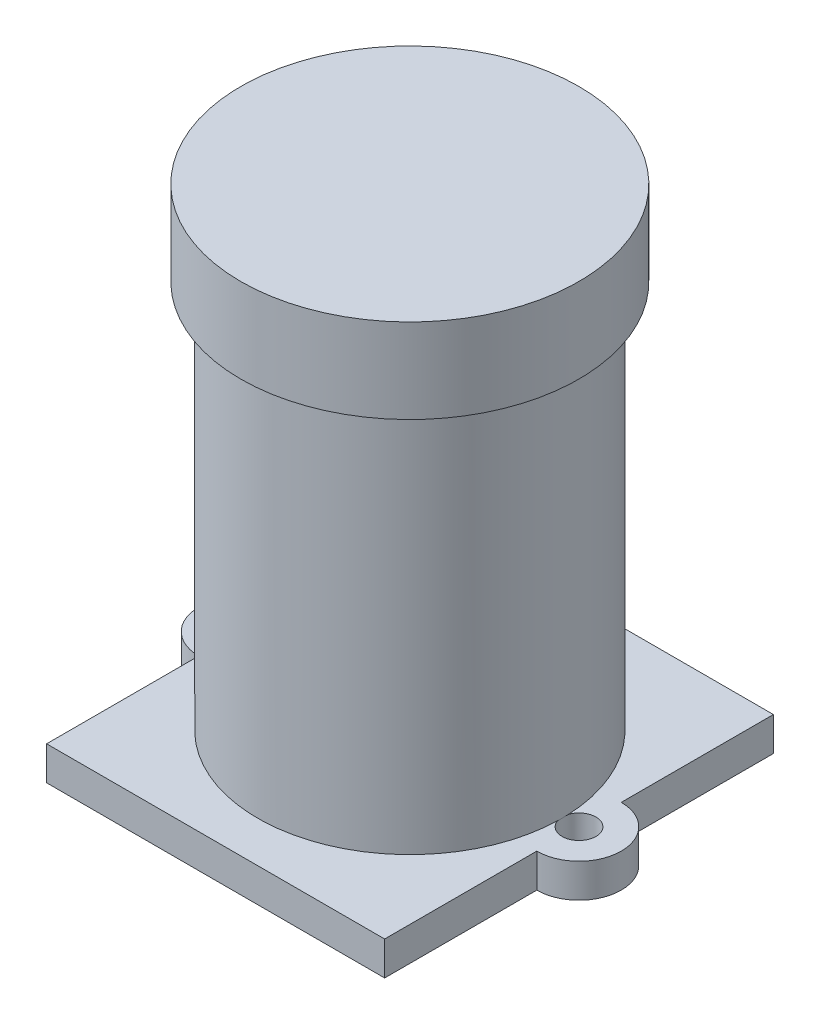
ISO-10303-21;
HEADER;
FILE_DESCRIPTION(('STEP AP214'),'2;1');
FILE_NAME('part.step','',(''),(''),'','','');
FILE_SCHEMA(('AUTOMOTIVE_DESIGN { 1 0 10303 214 1 1 1 1 }'));
ENDSEC;
DATA;
#1=APPLICATION_CONTEXT('core data for automotive mechanical design processes');
#2=APPLICATION_PROTOCOL_DEFINITION('international standard','automotive_design',2000,#1);
#3=PRODUCT_CONTEXT('',#1,'mechanical');
#4=PRODUCT('Part','Part','',(#3));
#5=PRODUCT_RELATED_PRODUCT_CATEGORY('part','',(#4));
#6=PRODUCT_DEFINITION_FORMATION('','',#4);
#7=PRODUCT_DEFINITION_CONTEXT('part definition',#1,'design');
#8=PRODUCT_DEFINITION('design','',#6,#7);
#9=PRODUCT_DEFINITION_SHAPE('','',#8);
#10=(LENGTH_UNIT() NAMED_UNIT(*) SI_UNIT(.MILLI.,.METRE.));
#11=(NAMED_UNIT(*) PLANE_ANGLE_UNIT() SI_UNIT($,.RADIAN.));
#12=(NAMED_UNIT(*) SI_UNIT($,.STERADIAN.) SOLID_ANGLE_UNIT());
#13=UNCERTAINTY_MEASURE_WITH_UNIT(LENGTH_MEASURE(1.E-05),#10,'distance_accuracy_value','');
#14=(GEOMETRIC_REPRESENTATION_CONTEXT(3) GLOBAL_UNCERTAINTY_ASSIGNED_CONTEXT((#13)) GLOBAL_UNIT_ASSIGNED_CONTEXT((#10,
#11,#12)) REPRESENTATION_CONTEXT('',''));
#15=CARTESIAN_POINT('',(0.,0.,0.));
#16=DIRECTION('',(0.,0.,1.));
#17=DIRECTION('',(1.,0.,0.));
#18=AXIS2_PLACEMENT_3D('',#15,#16,#17);
#19=CARTESIAN_POINT('',(0.,2.,0.));
#20=DIRECTION('',(1.,0.,0.));
#21=DIRECTION('',(0.,0.,-1.));
#22=AXIS2_PLACEMENT_3D('',#19,#20,#21);
#23=PLANE('',#22);
#24=DIRECTION('',(0.,0.,1.));
#25=VECTOR('',#24,1.);
#26=CARTESIAN_POINT('',(0.,0.,0.));
#27=LINE('',#26,#25);
#28=CARTESIAN_POINT('',(0.,0.,0.));
#29=VERTEX_POINT('',#28);
#30=CARTESIAN_POINT('',(0.,0.,9.));
#31=VERTEX_POINT('',#30);
#32=EDGE_CURVE('E163',#29,#31,#27,.T.);
#33=ORIENTED_EDGE('',*,*,#32,.T.);
#34=DIRECTION('',(0.,-1.,0.));
#35=VECTOR('',#34,1.);
#36=CARTESIAN_POINT('',(0.,2.,9.));
#37=LINE('',#36,#35);
#38=CARTESIAN_POINT('',(0.,2.,9.));
#39=VERTEX_POINT('',#38);
#40=EDGE_CURVE('E45',#39,#31,#37,.T.);
#41=ORIENTED_EDGE('',*,*,#40,.F.);
#42=DIRECTION('',(0.,0.,1.));
#43=VECTOR('',#42,1.);
#44=CARTESIAN_POINT('',(0.,2.,0.));
#45=LINE('',#44,#43);
#46=CARTESIAN_POINT('',(0.,2.,0.));
#47=VERTEX_POINT('',#46);
#48=EDGE_CURVE('E234',#47,#39,#45,.T.);
#49=ORIENTED_EDGE('',*,*,#48,.F.);
#50=DIRECTION('',(0.,-1.,0.));
#51=VECTOR('',#50,1.);
#52=CARTESIAN_POINT('',(0.,2.,0.));
#53=LINE('',#52,#51);
#54=EDGE_CURVE('E65',#47,#29,#53,.T.);
#55=ORIENTED_EDGE('',*,*,#54,.T.);
#56=EDGE_LOOP('',(#33,#41,#49,#55));
#57=FACE_BOUND('',#56,.T.);
#58=ADVANCED_FACE('F41',(#57),#23,.F.);
#59=CARTESIAN_POINT('',(0.,2.,11.5));
#60=DIRECTION('',(0.,-1.,0.));
#61=DIRECTION('',(0.,0.,-1.));
#62=AXIS2_PLACEMENT_3D('',#59,#60,#61);
#63=CYLINDRICAL_SURFACE('',#62,2.5);
#64=CARTESIAN_POINT('',(0.,0.,11.5));
#65=DIRECTION('',(0.,1.,0.));
#66=DIRECTION('',(0.,0.,1.));
#67=AXIS2_PLACEMENT_3D('',#64,#65,#66);
#68=CIRCLE('',#67,2.5);
#69=CARTESIAN_POINT('',(0.,0.,14.));
#70=VERTEX_POINT('',#69);
#71=EDGE_CURVE('E166',#31,#70,#68,.T.);
#72=ORIENTED_EDGE('',*,*,#71,.T.);
#73=DIRECTION('',(0.,-1.,0.));
#74=VECTOR('',#73,1.);
#75=CARTESIAN_POINT('',(0.,2.,14.));
#76=LINE('',#75,#74);
#77=CARTESIAN_POINT('',(0.,2.,14.));
#78=VERTEX_POINT('',#77);
#79=EDGE_CURVE('E202',#78,#70,#76,.T.);
#80=ORIENTED_EDGE('',*,*,#79,.F.);
#81=CARTESIAN_POINT('',(0.,2.,11.5));
#82=DIRECTION('',(0.,1.,0.));
#83=DIRECTION('',(0.,0.,1.));
#84=AXIS2_PLACEMENT_3D('',#81,#82,#83);
#85=CIRCLE('',#84,2.5);
#86=EDGE_CURVE('E105',#39,#78,#85,.T.);
#87=ORIENTED_EDGE('',*,*,#86,.F.);
#88=ORIENTED_EDGE('',*,*,#40,.T.);
#89=EDGE_LOOP('',(#72,#80,#87,#88));
#90=FACE_BOUND('',#89,.T.);
#91=ADVANCED_FACE('F210',(#90),#63,.T.);
#92=CARTESIAN_POINT('',(0.,2.,0.));
#93=DIRECTION('',(1.,0.,0.));
#94=DIRECTION('',(0.,0.,-1.));
#95=AXIS2_PLACEMENT_3D('',#92,#93,#94);
#96=PLANE('',#95);
#97=DIRECTION('',(0.,0.,1.));
#98=VECTOR('',#97,1.);
#99=CARTESIAN_POINT('',(0.,0.,0.));
#100=LINE('',#99,#98);
#101=CARTESIAN_POINT('',(0.,0.,23.));
#102=VERTEX_POINT('',#101);
#103=EDGE_CURVE('E169',#70,#102,#100,.T.);
#104=ORIENTED_EDGE('',*,*,#103,.T.);
#105=DIRECTION('',(0.,-1.,0.));
#106=VECTOR('',#105,1.);
#107=CARTESIAN_POINT('',(0.,2.,23.));
#108=LINE('',#107,#106);
#109=CARTESIAN_POINT('',(0.,2.,23.));
#110=VERTEX_POINT('',#109);
#111=EDGE_CURVE('E199',#110,#102,#108,.T.);
#112=ORIENTED_EDGE('',*,*,#111,.F.);
#113=DIRECTION('',(0.,0.,1.));
#114=VECTOR('',#113,1.);
#115=CARTESIAN_POINT('',(0.,2.,0.));
#116=LINE('',#115,#114);
#117=EDGE_CURVE('E224',#78,#110,#116,.T.);
#118=ORIENTED_EDGE('',*,*,#117,.F.);
#119=ORIENTED_EDGE('',*,*,#79,.T.);
#120=EDGE_LOOP('',(#104,#112,#118,#119));
#121=FACE_BOUND('',#120,.T.);
#122=ADVANCED_FACE('F223',(#121),#96,.F.);
#123=CARTESIAN_POINT('',(0.,2.,23.));
#124=DIRECTION('',(0.,0.,-1.));
#125=DIRECTION('',(-1.,0.,0.));
#126=AXIS2_PLACEMENT_3D('',#123,#124,#125);
#127=PLANE('',#126);
#128=DIRECTION('',(1.,0.,0.));
#129=VECTOR('',#128,1.);
#130=CARTESIAN_POINT('',(0.,0.,23.));
#131=LINE('',#130,#129);
#132=CARTESIAN_POINT('',(20.,0.,23.));
#133=VERTEX_POINT('',#132);
#134=EDGE_CURVE('E172',#102,#133,#131,.T.);
#135=ORIENTED_EDGE('',*,*,#134,.T.);
#136=DIRECTION('',(0.,-1.,0.));
#137=VECTOR('',#136,1.);
#138=CARTESIAN_POINT('',(20.,2.,23.));
#139=LINE('',#138,#137);
#140=CARTESIAN_POINT('',(20.,2.,23.));
#141=VERTEX_POINT('',#140);
#142=EDGE_CURVE('E196',#141,#133,#139,.T.);
#143=ORIENTED_EDGE('',*,*,#142,.F.);
#144=DIRECTION('',(1.,0.,0.));
#145=VECTOR('',#144,1.);
#146=CARTESIAN_POINT('',(0.,2.,23.));
#147=LINE('',#146,#145);
#148=EDGE_CURVE('E225',#110,#141,#147,.T.);
#149=ORIENTED_EDGE('',*,*,#148,.F.);
#150=ORIENTED_EDGE('',*,*,#111,.T.);
#151=EDGE_LOOP('',(#135,#143,#149,#150));
#152=FACE_BOUND('',#151,.T.);
#153=ADVANCED_FACE('F221',(#152),#127,.F.);
#154=CARTESIAN_POINT('',(20.,2.,0.));
#155=DIRECTION('',(1.,0.,0.));
#156=DIRECTION('',(0.,0.,-1.));
#157=AXIS2_PLACEMENT_3D('',#154,#155,#156);
#158=PLANE('',#157);
#159=DIRECTION('',(0.,0.,1.));
#160=VECTOR('',#159,1.);
#161=CARTESIAN_POINT('',(20.,0.,0.));
#162=LINE('',#161,#160);
#163=CARTESIAN_POINT('',(20.,0.,14.));
#164=VERTEX_POINT('',#163);
#165=EDGE_CURVE('E176',#164,#133,#162,.T.);
#166=ORIENTED_EDGE('',*,*,#165,.F.);
#167=DIRECTION('',(0.,-1.,0.));
#168=VECTOR('',#167,1.);
#169=CARTESIAN_POINT('',(20.,2.,14.));
#170=LINE('',#169,#168);
#171=CARTESIAN_POINT('',(20.,2.,14.));
#172=VERTEX_POINT('',#171);
#173=EDGE_CURVE('E143',#172,#164,#170,.T.);
#174=ORIENTED_EDGE('',*,*,#173,.F.);
#175=DIRECTION('',(0.,0.,1.));
#176=VECTOR('',#175,1.);
#177=CARTESIAN_POINT('',(20.,2.,0.));
#178=LINE('',#177,#176);
#179=EDGE_CURVE('E130',#172,#141,#178,.T.);
#180=ORIENTED_EDGE('',*,*,#179,.T.);
#181=ORIENTED_EDGE('',*,*,#142,.T.);
#182=EDGE_LOOP('',(#166,#174,#180,#181));
#183=FACE_BOUND('',#182,.T.);
#184=ADVANCED_FACE('F217',(#183),#158,.T.);
#185=CARTESIAN_POINT('',(20.,2.,11.5));
#186=DIRECTION('',(0.,-1.,0.));
#187=DIRECTION('',(0.,0.,-1.));
#188=AXIS2_PLACEMENT_3D('',#185,#186,#187);
#189=CYLINDRICAL_SURFACE('',#188,2.5);
#190=CARTESIAN_POINT('',(20.,0.,11.5));
#191=DIRECTION('',(0.,1.,0.));
#192=DIRECTION('',(0.,0.,1.));
#193=AXIS2_PLACEMENT_3D('',#190,#191,#192);
#194=CIRCLE('',#193,2.5);
#195=CARTESIAN_POINT('',(20.,0.,9.));
#196=VERTEX_POINT('',#195);
#197=EDGE_CURVE('E138',#164,#196,#194,.T.);
#198=ORIENTED_EDGE('',*,*,#197,.T.);
#199=DIRECTION('',(0.,-1.,0.));
#200=VECTOR('',#199,1.);
#201=CARTESIAN_POINT('',(20.,2.,9.));
#202=LINE('',#201,#200);
#203=CARTESIAN_POINT('',(20.,2.,9.));
#204=VERTEX_POINT('',#203);
#205=EDGE_CURVE('E135',#204,#196,#202,.T.);
#206=ORIENTED_EDGE('',*,*,#205,.F.);
#207=CARTESIAN_POINT('',(20.,2.,11.5));
#208=DIRECTION('',(0.,1.,0.));
#209=DIRECTION('',(0.,0.,1.));
#210=AXIS2_PLACEMENT_3D('',#207,#208,#209);
#211=CIRCLE('',#210,2.5);
#212=EDGE_CURVE('E123',#172,#204,#211,.T.);
#213=ORIENTED_EDGE('',*,*,#212,.F.);
#214=ORIENTED_EDGE('',*,*,#173,.T.);
#215=EDGE_LOOP('',(#198,#206,#213,#214));
#216=FACE_BOUND('',#215,.T.);
#217=ADVANCED_FACE('F136',(#216),#189,.T.);
#218=CARTESIAN_POINT('',(20.,2.,0.));
#219=DIRECTION('',(1.,0.,0.));
#220=DIRECTION('',(0.,0.,-1.));
#221=AXIS2_PLACEMENT_3D('',#218,#219,#220);
#222=PLANE('',#221);
#223=DIRECTION('',(0.,0.,1.));
#224=VECTOR('',#223,1.);
#225=CARTESIAN_POINT('',(20.,0.,0.));
#226=LINE('',#225,#224);
#227=CARTESIAN_POINT('',(20.,0.,0.));
#228=VERTEX_POINT('',#227);
#229=EDGE_CURVE('E182',#228,#196,#226,.T.);
#230=ORIENTED_EDGE('',*,*,#229,.F.);
#231=DIRECTION('',(0.,-1.,0.));
#232=VECTOR('',#231,1.);
#233=CARTESIAN_POINT('',(20.,2.,0.));
#234=LINE('',#233,#232);
#235=CARTESIAN_POINT('',(20.,2.,0.));
#236=VERTEX_POINT('',#235);
#237=EDGE_CURVE('E144',#236,#228,#234,.T.);
#238=ORIENTED_EDGE('',*,*,#237,.F.);
#239=DIRECTION('',(0.,0.,1.));
#240=VECTOR('',#239,1.);
#241=CARTESIAN_POINT('',(20.,2.,0.));
#242=LINE('',#241,#240);
#243=EDGE_CURVE('E128',#236,#204,#242,.T.);
#244=ORIENTED_EDGE('',*,*,#243,.T.);
#245=ORIENTED_EDGE('',*,*,#205,.T.);
#246=EDGE_LOOP('',(#230,#238,#244,#245));
#247=FACE_BOUND('',#246,.T.);
#248=ADVANCED_FACE('F146',(#247),#222,.T.);
#249=CARTESIAN_POINT('',(20.,2.,11.5));
#250=DIRECTION('',(0.,-1.,0.));
#251=DIRECTION('',(0.,0.,-1.));
#252=AXIS2_PLACEMENT_3D('',#249,#250,#251);
#253=CYLINDRICAL_SURFACE('',#252,1.);
#254=CARTESIAN_POINT('',(20.,2.,11.5));
#255=DIRECTION('',(0.,1.,0.));
#256=DIRECTION('',(0.,0.,1.));
#257=AXIS2_PLACEMENT_3D('',#254,#255,#256);
#258=CIRCLE('',#257,1.);
#259=CARTESIAN_POINT('',(19.0535568816368,2.,11.1771294009932));
#260=VERTEX_POINT('',#259);
#261=CARTESIAN_POINT('',(19.058302830222,2.,11.8364616477878));
#262=VERTEX_POINT('',#261);
#263=EDGE_CURVE('E237',#260,#262,#258,.T.);
#264=ORIENTED_EDGE('',*,*,#263,.T.);
#265=EDGE_CURVE('E241',#262,#260,#258,.T.);
#266=ORIENTED_EDGE('',*,*,#265,.T.);
#267=EDGE_LOOP('',(#264,#266));
#268=FACE_BOUND('',#267,.T.);
#269=CARTESIAN_POINT('',(20.,0.,11.5));
#270=DIRECTION('',(0.,1.,0.));
#271=DIRECTION('',(0.,0.,1.));
#272=AXIS2_PLACEMENT_3D('',#269,#270,#271);
#273=CIRCLE('',#272,1.);
#274=CARTESIAN_POINT('',(20.,0.,12.5));
#275=VERTEX_POINT('',#274);
#276=EDGE_CURVE('E158',#275,#275,#273,.T.);
#277=ORIENTED_EDGE('',*,*,#276,.F.);
#278=EDGE_LOOP('',(#277));
#279=FACE_BOUND('',#278,.T.);
#280=ADVANCED_FACE('F283',(#268,#279),#253,.F.);
#281=CARTESIAN_POINT('',(0.,2.,11.5));
#282=DIRECTION('',(0.,-1.,0.));
#283=DIRECTION('',(0.,0.,-1.));
#284=AXIS2_PLACEMENT_3D('',#281,#282,#283);
#285=CYLINDRICAL_SURFACE('',#284,1.);
#286=CARTESIAN_POINT('',(0.,2.,11.5));
#287=DIRECTION('',(0.,1.,0.));
#288=DIRECTION('',(0.,0.,1.));
#289=AXIS2_PLACEMENT_3D('',#286,#287,#288);
#290=CIRCLE('',#289,1.);
#291=CARTESIAN_POINT('',(0.,2.,12.5));
#292=VERTEX_POINT('',#291);
#293=EDGE_CURVE('E189',#292,#292,#290,.T.);
#294=ORIENTED_EDGE('',*,*,#293,.T.);
#295=EDGE_LOOP('',(#294));
#296=FACE_BOUND('',#295,.T.);
#297=CARTESIAN_POINT('',(0.,0.,11.5));
#298=DIRECTION('',(0.,1.,0.));
#299=DIRECTION('',(0.,0.,1.));
#300=AXIS2_PLACEMENT_3D('',#297,#298,#299);
#301=CIRCLE('',#300,1.);
#302=CARTESIAN_POINT('',(0.,0.,12.5));
#303=VERTEX_POINT('',#302);
#304=EDGE_CURVE('E154',#303,#303,#301,.T.);
#305=ORIENTED_EDGE('',*,*,#304,.F.);
#306=EDGE_LOOP('',(#305));
#307=FACE_BOUND('',#306,.T.);
#308=ADVANCED_FACE('F43',(#296,#307),#285,.F.);
#309=CARTESIAN_POINT('',(0.,2.,0.));
#310=DIRECTION('',(0.,0.,-1.));
#311=DIRECTION('',(-1.,0.,0.));
#312=AXIS2_PLACEMENT_3D('',#309,#310,#311);
#313=PLANE('',#312);
#314=DIRECTION('',(1.,0.,0.));
#315=VECTOR('',#314,1.);
#316=CARTESIAN_POINT('',(0.,0.,0.));
#317=LINE('',#316,#315);
#318=EDGE_CURVE('E185',#29,#228,#317,.T.);
#319=ORIENTED_EDGE('',*,*,#318,.F.);
#320=ORIENTED_EDGE('',*,*,#54,.F.);
#321=DIRECTION('',(1.,0.,0.));
#322=VECTOR('',#321,1.);
#323=CARTESIAN_POINT('',(0.,2.,0.));
#324=LINE('',#323,#322);
#325=EDGE_CURVE('E148',#47,#236,#324,.T.);
#326=ORIENTED_EDGE('',*,*,#325,.T.);
#327=ORIENTED_EDGE('',*,*,#237,.T.);
#328=EDGE_LOOP('',(#319,#320,#326,#327));
#329=FACE_BOUND('',#328,.T.);
#330=ADVANCED_FACE('F213',(#329),#313,.T.);
#331=CARTESIAN_POINT('',(0.,2.,0.));
#332=DIRECTION('',(0.,1.,0.));
#333=DIRECTION('',(0.,0.,1.));
#334=AXIS2_PLACEMENT_3D('',#331,#332,#333);
#335=PLANE('',#334);
#336=CARTESIAN_POINT('',(10.062202951902,2.,11.5715333946873));
#337=DIRECTION('',(0.,1.,0.));
#338=DIRECTION('',(0.,0.,1.));
#339=AXIS2_PLACEMENT_3D('',#336,#337,#338);
#340=CIRCLE('',#339,9.);
#341=EDGE_CURVE('E11',#260,#262,#340,.T.);
#342=ORIENTED_EDGE('',*,*,#341,.F.);
#343=ORIENTED_EDGE('',*,*,#265,.F.);
#344=EDGE_LOOP('',(#342,#343));
#345=FACE_BOUND('',#344,.T.);
#346=ORIENTED_EDGE('',*,*,#293,.F.);
#347=EDGE_LOOP('',(#346));
#348=FACE_BOUND('',#347,.T.);
#349=ORIENTED_EDGE('',*,*,#48,.T.);
#350=ORIENTED_EDGE('',*,*,#86,.T.);
#351=ORIENTED_EDGE('',*,*,#117,.T.);
#352=ORIENTED_EDGE('',*,*,#148,.T.);
#353=ORIENTED_EDGE('',*,*,#179,.F.);
#354=ORIENTED_EDGE('',*,*,#212,.T.);
#355=ORIENTED_EDGE('',*,*,#243,.F.);
#356=ORIENTED_EDGE('',*,*,#325,.F.);
#357=EDGE_LOOP('',(#349,#350,#351,#352,#353,#354,#355,#356));
#358=FACE_BOUND('',#357,.T.);
#359=ADVANCED_FACE('F125',(#345,#348,#358),#335,.T.);
#360=CARTESIAN_POINT('',(0.,0.,0.));
#361=DIRECTION('',(0.,1.,0.));
#362=DIRECTION('',(0.,0.,1.));
#363=AXIS2_PLACEMENT_3D('',#360,#361,#362);
#364=PLANE('',#363);
#365=ORIENTED_EDGE('',*,*,#304,.T.);
#366=EDGE_LOOP('',(#365));
#367=FACE_BOUND('',#366,.T.);
#368=ORIENTED_EDGE('',*,*,#276,.T.);
#369=EDGE_LOOP('',(#368));
#370=FACE_BOUND('',#369,.T.);
#371=ORIENTED_EDGE('',*,*,#32,.F.);
#372=ORIENTED_EDGE('',*,*,#318,.T.);
#373=ORIENTED_EDGE('',*,*,#229,.T.);
#374=ORIENTED_EDGE('',*,*,#197,.F.);
#375=ORIENTED_EDGE('',*,*,#165,.T.);
#376=ORIENTED_EDGE('',*,*,#134,.F.);
#377=ORIENTED_EDGE('',*,*,#103,.F.);
#378=ORIENTED_EDGE('',*,*,#71,.F.);
#379=EDGE_LOOP('',(#371,#372,#373,#374,#375,#376,#377,#378));
#380=FACE_BOUND('',#379,.T.);
#381=ADVANCED_FACE('F212',(#367,#370,#380),#364,.F.);
#382=CARTESIAN_POINT('',(10.062202951902,25.,11.5715333946873));
#383=DIRECTION('',(0.,-1.,0.));
#384=DIRECTION('',(0.,0.,-1.));
#385=AXIS2_PLACEMENT_3D('',#382,#383,#384);
#386=CYLINDRICAL_SURFACE('',#385,9.);
#387=CARTESIAN_POINT('',(10.062202951902,25.,11.5715333946873));
#388=DIRECTION('',(0.,1.,0.));
#389=DIRECTION('',(0.,0.,1.));
#390=AXIS2_PLACEMENT_3D('',#387,#388,#389);
#391=CIRCLE('',#390,9.);
#392=CARTESIAN_POINT('',(10.062202951902,25.,20.5715333946873));
#393=VERTEX_POINT('',#392);
#394=EDGE_CURVE('E159',#393,#393,#391,.T.);
#395=ORIENTED_EDGE('',*,*,#394,.F.);
#396=EDGE_LOOP('',(#395));
#397=FACE_BOUND('',#396,.T.);
#398=EDGE_CURVE('E52',#262,#260,#340,.T.);
#399=ORIENTED_EDGE('',*,*,#398,.T.);
#400=ORIENTED_EDGE('',*,*,#341,.T.);
#401=EDGE_LOOP('',(#399,#400));
#402=FACE_BOUND('',#401,.T.);
#403=ADVANCED_FACE('F297',(#397,#402),#386,.T.);
#404=CARTESIAN_POINT('',(10.062202951902,2.,11.5715333946873));
#405=DIRECTION('',(0.,1.,0.));
#406=DIRECTION('',(0.,0.,1.));
#407=AXIS2_PLACEMENT_3D('',#404,#405,#406);
#408=PLANE('',#407);
#409=ORIENTED_EDGE('',*,*,#263,.F.);
#410=ORIENTED_EDGE('',*,*,#398,.F.);
#411=EDGE_LOOP('',(#409,#410));
#412=FACE_BOUND('',#411,.T.);
#413=ADVANCED_FACE('F264',(#412),#408,.F.);
#414=CARTESIAN_POINT('',(10.062202951902,30.,11.5715333946873));
#415=DIRECTION('',(0.,-1.,0.));
#416=DIRECTION('',(0.,0.,-1.));
#417=AXIS2_PLACEMENT_3D('',#414,#415,#416);
#418=CYLINDRICAL_SURFACE('',#417,10.);
#419=CARTESIAN_POINT('',(10.062202951902,30.,11.5715333946873));
#420=DIRECTION('',(0.,1.,0.));
#421=DIRECTION('',(0.,0.,1.));
#422=AXIS2_PLACEMENT_3D('',#419,#420,#421);
#423=CIRCLE('',#422,10.);
#424=CARTESIAN_POINT('',(10.062202951902,30.,21.5715333946873));
#425=VERTEX_POINT('',#424);
#426=EDGE_CURVE('E247',#425,#425,#423,.T.);
#427=ORIENTED_EDGE('',*,*,#426,.F.);
#428=EDGE_LOOP('',(#427));
#429=FACE_BOUND('',#428,.T.);
#430=CARTESIAN_POINT('',(10.062202951902,25.,11.5715333946873));
#431=DIRECTION('',(0.,1.,0.));
#432=DIRECTION('',(0.,0.,1.));
#433=AXIS2_PLACEMENT_3D('',#430,#431,#432);
#434=CIRCLE('',#433,10.);
#435=CARTESIAN_POINT('',(10.062202951902,25.,21.5715333946873));
#436=VERTEX_POINT('',#435);
#437=EDGE_CURVE('E251',#436,#436,#434,.T.);
#438=ORIENTED_EDGE('',*,*,#437,.T.);
#439=EDGE_LOOP('',(#438));
#440=FACE_BOUND('',#439,.T.);
#441=ADVANCED_FACE('F261',(#429,#440),#418,.T.);
#442=CARTESIAN_POINT('',(10.062202951902,30.,11.5715333946873));
#443=DIRECTION('',(0.,1.,0.));
#444=DIRECTION('',(0.,0.,1.));
#445=AXIS2_PLACEMENT_3D('',#442,#443,#444);
#446=PLANE('',#445);
#447=ORIENTED_EDGE('',*,*,#426,.T.);
#448=EDGE_LOOP('',(#447));
#449=FACE_BOUND('',#448,.T.);
#450=ADVANCED_FACE('F259',(#449),#446,.T.);
#451=CARTESIAN_POINT('',(10.062202951902,25.,11.5715333946873));
#452=DIRECTION('',(0.,1.,0.));
#453=DIRECTION('',(0.,0.,1.));
#454=AXIS2_PLACEMENT_3D('',#451,#452,#453);
#455=PLANE('',#454);
#456=ORIENTED_EDGE('',*,*,#394,.T.);
#457=EDGE_LOOP('',(#456));
#458=FACE_BOUND('',#457,.T.);
#459=ORIENTED_EDGE('',*,*,#437,.F.);
#460=EDGE_LOOP('',(#459));
#461=FACE_BOUND('',#460,.T.);
#462=ADVANCED_FACE('F268',(#458,#461),#455,.F.);
#463=CLOSED_SHELL('',(#58,#91,#122,#153,#184,#217,#248,#280,#308,#330,#359,#381,#403,#413,#441,
#450,#462));
#464=MANIFOLD_SOLID_BREP('B2',#463);
#465=ADVANCED_BREP_SHAPE_REPRESENTATION('',(#18,#464),#14);
#466=SHAPE_DEFINITION_REPRESENTATION(#9,#465);
ENDSEC;
END-ISO-10303-21;
